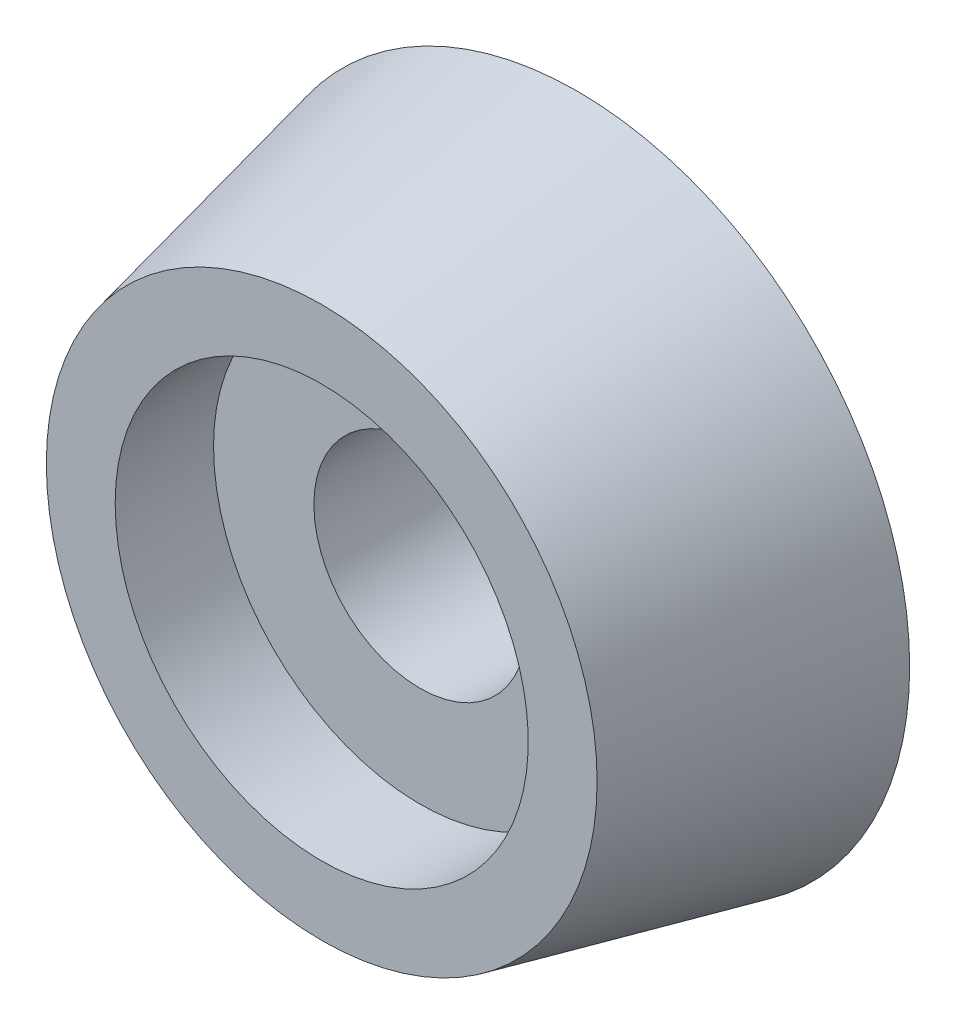
ISO-10303-21;
HEADER;
FILE_DESCRIPTION(('STEP AP214'),'2;1');
FILE_NAME('part.step','',(''),(''),'','','');
FILE_SCHEMA(('AUTOMOTIVE_DESIGN { 1 0 10303 214 1 1 1 1 }'));
ENDSEC;
DATA;
#1=APPLICATION_CONTEXT('core data for automotive mechanical design processes');
#2=APPLICATION_PROTOCOL_DEFINITION('international standard','automotive_design',2000,#1);
#3=PRODUCT_CONTEXT('',#1,'mechanical');
#4=PRODUCT('Part','Part','',(#3));
#5=PRODUCT_RELATED_PRODUCT_CATEGORY('part','',(#4));
#6=PRODUCT_DEFINITION_FORMATION('','',#4);
#7=PRODUCT_DEFINITION_CONTEXT('part definition',#1,'design');
#8=PRODUCT_DEFINITION('design','',#6,#7);
#9=PRODUCT_DEFINITION_SHAPE('','',#8);
#10=(LENGTH_UNIT() NAMED_UNIT(*) SI_UNIT(.MILLI.,.METRE.));
#11=(NAMED_UNIT(*) PLANE_ANGLE_UNIT() SI_UNIT($,.RADIAN.));
#12=(NAMED_UNIT(*) SI_UNIT($,.STERADIAN.) SOLID_ANGLE_UNIT());
#13=UNCERTAINTY_MEASURE_WITH_UNIT(LENGTH_MEASURE(1.E-05),#10,'distance_accuracy_value','');
#14=(GEOMETRIC_REPRESENTATION_CONTEXT(3) GLOBAL_UNCERTAINTY_ASSIGNED_CONTEXT((#13)) GLOBAL_UNIT_ASSIGNED_CONTEXT((#10,
#11,#12)) REPRESENTATION_CONTEXT('',''));
#15=CARTESIAN_POINT('',(0.,0.,0.));
#16=DIRECTION('',(0.,0.,1.));
#17=DIRECTION('',(1.,0.,0.));
#18=AXIS2_PLACEMENT_3D('',#15,#16,#17);
#19=CARTESIAN_POINT('',(0.,0.,-1.5));
#20=DIRECTION('',(0.,0.,1.));
#21=DIRECTION('',(1.,0.,0.));
#22=AXIS2_PLACEMENT_3D('',#19,#20,#21);
#23=PLANE('',#22);
#24=CARTESIAN_POINT('',(0.,0.,-1.5));
#25=DIRECTION('',(0.,0.,-1.));
#26=DIRECTION('',(-1.,0.,0.));
#27=AXIS2_PLACEMENT_3D('',#24,#25,#26);
#28=CIRCLE('',#27,2.7);
#29=CARTESIAN_POINT('',(-2.7,0.,-1.5));
#30=VERTEX_POINT('',#29);
#31=EDGE_CURVE('E33',#30,#30,#28,.T.);
#32=ORIENTED_EDGE('',*,*,#31,.T.);
#33=EDGE_LOOP('',(#32));
#34=FACE_BOUND('',#33,.T.);
#35=CARTESIAN_POINT('',(0.,0.,-1.5));
#36=DIRECTION('',(0.,0.,-1.));
#37=DIRECTION('',(-1.,0.,0.));
#38=AXIS2_PLACEMENT_3D('',#35,#36,#37);
#39=CIRCLE('',#38,5.25);
#40=CARTESIAN_POINT('',(-5.25,0.,-1.5));
#41=VERTEX_POINT('',#40);
#42=EDGE_CURVE('E17',#41,#41,#39,.F.);
#43=ORIENTED_EDGE('',*,*,#42,.T.);
#44=EDGE_LOOP('',(#43));
#45=FACE_BOUND('',#44,.T.);
#46=ADVANCED_FACE('F14',(#34,#45),#23,.T.);
#47=CARTESIAN_POINT('',(0.,0.,0.999999999999999));
#48=DIRECTION('',(0.,0.,-1.));
#49=DIRECTION('',(-1.,0.,0.));
#50=AXIS2_PLACEMENT_3D('',#47,#48,#49);
#51=CYLINDRICAL_SURFACE('',#50,5.25);
#52=CARTESIAN_POINT('',(0.,0.,0.999999999999999));
#53=DIRECTION('',(0.,0.,-1.));
#54=DIRECTION('',(-1.,0.,0.));
#55=AXIS2_PLACEMENT_3D('',#52,#53,#54);
#56=CIRCLE('',#55,5.25);
#57=CARTESIAN_POINT('',(-5.25,0.,0.999999999999999));
#58=VERTEX_POINT('',#57);
#59=EDGE_CURVE('E31',#58,#58,#56,.F.);
#60=ORIENTED_EDGE('',*,*,#59,.T.);
#61=EDGE_LOOP('',(#60));
#62=FACE_BOUND('',#61,.T.);
#63=ORIENTED_EDGE('',*,*,#42,.F.);
#64=EDGE_LOOP('',(#63));
#65=FACE_BOUND('',#64,.T.);
#66=ADVANCED_FACE('F41',(#62,#65),#51,.F.);
#67=CARTESIAN_POINT('',(0.,0.,0.999999999999999));
#68=DIRECTION('',(0.,0.,-1.));
#69=DIRECTION('',(-1.,0.,0.));
#70=AXIS2_PLACEMENT_3D('',#67,#68,#69);
#71=CYLINDRICAL_SURFACE('',#70,2.7);
#72=CARTESIAN_POINT('',(0.,0.,-5.5));
#73=DIRECTION('',(0.,0.,-1.));
#74=DIRECTION('',(-1.,0.,0.));
#75=AXIS2_PLACEMENT_3D('',#72,#73,#74);
#76=CIRCLE('',#75,2.7);
#77=CARTESIAN_POINT('',(-2.7,0.,-5.5));
#78=VERTEX_POINT('',#77);
#79=EDGE_CURVE('E26',#78,#78,#76,.T.);
#80=ORIENTED_EDGE('',*,*,#79,.T.);
#81=EDGE_LOOP('',(#80));
#82=FACE_BOUND('',#81,.T.);
#83=ORIENTED_EDGE('',*,*,#31,.F.);
#84=EDGE_LOOP('',(#83));
#85=FACE_BOUND('',#84,.T.);
#86=ADVANCED_FACE('F43',(#82,#85),#71,.F.);
#87=CARTESIAN_POINT('',(0.,0.,0.999999999999999));
#88=DIRECTION('',(0.,0.,-1.));
#89=DIRECTION('',(-1.,0.,0.));
#90=AXIS2_PLACEMENT_3D('',#87,#88,#89);
#91=PLANE('',#90);
#92=ORIENTED_EDGE('',*,*,#59,.F.);
#93=EDGE_LOOP('',(#92));
#94=FACE_BOUND('',#93,.T.);
#95=CARTESIAN_POINT('',(0.,0.,1.));
#96=DIRECTION('',(0.,0.,-1.));
#97=DIRECTION('',(0.,1.,0.));
#98=AXIS2_PLACEMENT_3D('',#95,#96,#97);
#99=CIRCLE('',#98,7.);
#100=CARTESIAN_POINT('',(0.,7.,1.));
#101=VERTEX_POINT('',#100);
#102=EDGE_CURVE('E21',#101,#101,#99,.T.);
#103=ORIENTED_EDGE('',*,*,#102,.F.);
#104=EDGE_LOOP('',(#103));
#105=FACE_BOUND('',#104,.T.);
#106=ADVANCED_FACE('F50',(#94,#105),#91,.F.);
#107=CARTESIAN_POINT('',(0.,0.,-5.5));
#108=DIRECTION('',(0.,0.,1.));
#109=DIRECTION('',(1.,0.,0.));
#110=AXIS2_PLACEMENT_3D('',#107,#108,#109);
#111=PLANE('',#110);
#112=ORIENTED_EDGE('',*,*,#79,.F.);
#113=EDGE_LOOP('',(#112));
#114=FACE_BOUND('',#113,.T.);
#115=CARTESIAN_POINT('',(0.,0.,-5.5));
#116=DIRECTION('',(0.,0.,-1.));
#117=DIRECTION('',(0.,1.,0.));
#118=AXIS2_PLACEMENT_3D('',#115,#116,#117);
#119=CIRCLE('',#118,8.44444461663564);
#120=CARTESIAN_POINT('',(0.,8.44444461663564,-5.5));
#121=VERTEX_POINT('',#120);
#122=EDGE_CURVE('E10',#121,#121,#119,.F.);
#123=ORIENTED_EDGE('',*,*,#122,.F.);
#124=EDGE_LOOP('',(#123));
#125=FACE_BOUND('',#124,.T.);
#126=ADVANCED_FACE('F55',(#114,#125),#111,.F.);
#127=CARTESIAN_POINT('',(0.,0.,-5.5));
#128=DIRECTION('',(0.,0.,-1.));
#129=DIRECTION('',(0.,1.,0.));
#130=AXIS2_PLACEMENT_3D('',#127,#128,#129);
#131=CONICAL_SURFACE('',#130,8.44444461663564,0.218668971118262);
#132=ORIENTED_EDGE('',*,*,#122,.T.);
#133=EDGE_LOOP('',(#132));
#134=FACE_BOUND('',#133,.T.);
#135=ORIENTED_EDGE('',*,*,#102,.T.);
#136=EDGE_LOOP('',(#135));
#137=FACE_BOUND('',#136,.T.);
#138=ADVANCED_FACE('F53',(#134,#137),#131,.T.);
#139=CLOSED_SHELL('',(#46,#66,#86,#106,#126,#138));
#140=MANIFOLD_SOLID_BREP('B1',#139);
#141=ADVANCED_BREP_SHAPE_REPRESENTATION('',(#18,#140),#14);
#142=SHAPE_DEFINITION_REPRESENTATION(#9,#141);
ENDSEC;
END-ISO-10303-21;
